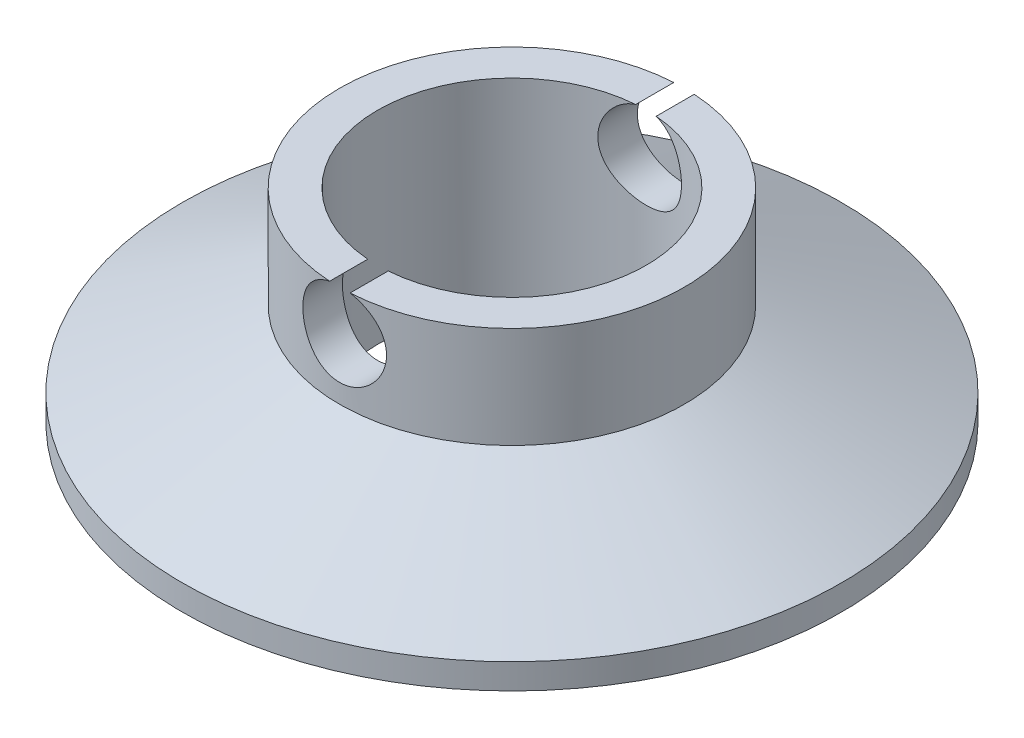
ISO-10303-21;
HEADER;
FILE_DESCRIPTION(('STEP AP214'),'2;1');
FILE_NAME('part.step','',(''),(''),'','','');
FILE_SCHEMA(('AUTOMOTIVE_DESIGN { 1 0 10303 214 1 1 1 1 }'));
ENDSEC;
DATA;
#1=APPLICATION_CONTEXT('core data for automotive mechanical design processes');
#2=APPLICATION_PROTOCOL_DEFINITION('international standard','automotive_design',2000,#1);
#3=PRODUCT_CONTEXT('',#1,'mechanical');
#4=PRODUCT('Part','Part','',(#3));
#5=PRODUCT_RELATED_PRODUCT_CATEGORY('part','',(#4));
#6=PRODUCT_DEFINITION_FORMATION('','',#4);
#7=PRODUCT_DEFINITION_CONTEXT('part definition',#1,'design');
#8=PRODUCT_DEFINITION('design','',#6,#7);
#9=PRODUCT_DEFINITION_SHAPE('','',#8);
#10=(LENGTH_UNIT() NAMED_UNIT(*) SI_UNIT(.MILLI.,.METRE.));
#11=(NAMED_UNIT(*) PLANE_ANGLE_UNIT() SI_UNIT($,.RADIAN.));
#12=(NAMED_UNIT(*) SI_UNIT($,.STERADIAN.) SOLID_ANGLE_UNIT());
#13=UNCERTAINTY_MEASURE_WITH_UNIT(LENGTH_MEASURE(1.E-05),#10,'distance_accuracy_value','');
#14=(GEOMETRIC_REPRESENTATION_CONTEXT(3) GLOBAL_UNCERTAINTY_ASSIGNED_CONTEXT((#13)) GLOBAL_UNIT_ASSIGNED_CONTEXT((#10,
#11,#12)) REPRESENTATION_CONTEXT('',''));
#15=CARTESIAN_POINT('',(0.,0.,0.));
#16=DIRECTION('',(0.,0.,1.));
#17=DIRECTION('',(1.,0.,0.));
#18=AXIS2_PLACEMENT_3D('',#15,#16,#17);
#19=CARTESIAN_POINT('',(5.3,12.9891874831611,0.));
#20=DIRECTION('',(0.,1.,0.));
#21=DIRECTION('',(-1.,0.,0.));
#22=AXIS2_PLACEMENT_3D('',#19,#20,#21);
#23=CYLINDRICAL_SURFACE('',#22,5.3);
#24=CARTESIAN_POINT('',(5.3,0.,0.));
#25=DIRECTION('',(0.,1.,0.));
#26=DIRECTION('',(-1.,0.,0.));
#27=AXIS2_PLACEMENT_3D('',#24,#25,#26);
#28=CIRCLE('',#27,5.3);
#29=CARTESIAN_POINT('',(0.,0.,0.));
#30=VERTEX_POINT('',#29);
#31=EDGE_CURVE('E82',#30,#30,#28,.T.);
#32=ORIENTED_EDGE('',*,*,#31,.F.);
#33=EDGE_LOOP('',(#32));
#34=FACE_BOUND('',#33,.T.);
#35=CARTESIAN_POINT('',(5.3,8.,0.));
#36=DIRECTION('',(0.,1.,0.));
#37=DIRECTION('',(-1.,0.,0.));
#38=AXIS2_PLACEMENT_3D('',#35,#36,#37);
#39=CIRCLE('',#38,5.3);
#40=CARTESIAN_POINT('',(4.89688711258507,8.,-5.28464757576132));
#41=VERTEX_POINT('',#40);
#42=CARTESIAN_POINT('',(4.89688711258507,8.,5.28464757576132));
#43=VERTEX_POINT('',#42);
#44=EDGE_CURVE('E86',#41,#43,#39,.T.);
#45=ORIENTED_EDGE('',*,*,#44,.T.);
#46=CARTESIAN_POINT('',(4.89688711258507,8.,5.28464757576132));
#47=CARTESIAN_POINT('',(4.85187303527529,7.9886592219359,5.28121678496733));
#48=CARTESIAN_POINT('',(4.80740221455885,7.97543341836276,5.27724266006828));
#49=CARTESIAN_POINT('',(4.71982730364138,7.94532986851614,5.26833288120692));
#50=CARTESIAN_POINT('',(4.67672282394611,7.92845317391061,5.26339750418158));
#51=CARTESIAN_POINT('',(4.55007062963855,7.87261381706816,5.24736274941369));
#52=CARTESIAN_POINT('',(4.46893641309748,7.82837889607839,5.23501472471735));
#53=CARTESIAN_POINT('',(4.31547814325736,7.72727882623887,5.20833959619137));
#54=CARTESIAN_POINT('',(4.24314896190254,7.67042108394121,5.19401365477805));
#55=CARTESIAN_POINT('',(4.10892819205841,7.54553480908309,5.1648879715981));
#56=CARTESIAN_POINT('',(4.04704069327803,7.47750192003121,5.15008804687359));
#57=CARTESIAN_POINT('',(3.93404414278354,7.33030476070273,5.12129382260728));
#58=CARTESIAN_POINT('',(3.88321070604488,7.25092342504644,5.10732533420736));
#59=CARTESIAN_POINT('',(3.7956493339156,7.08430989131347,5.08222526094042));
#60=CARTESIAN_POINT('',(3.75891910012355,6.99707897534691,5.0710932139176));
#61=CARTESIAN_POINT('',(3.70138315790502,6.81894340174766,5.05324864696181));
#62=CARTESIAN_POINT('',(3.68028432191817,6.72814188087293,5.04645512363811));
#63=CARTESIAN_POINT('',(3.6536750532422,6.54406426195088,5.03783853688604));
#64=CARTESIAN_POINT('',(3.64815914809733,6.45078904424163,5.03601372853907));
#65=CARTESIAN_POINT('',(3.65281810406351,6.26880385777008,5.03753825011536));
#66=CARTESIAN_POINT('',(3.66231294415675,6.18007367224953,5.04066334985724));
#67=CARTESIAN_POINT('',(3.69538135454225,6.00555368879652,5.05128659885817));
#68=CARTESIAN_POINT('',(3.71895572260249,5.91976405777173,5.05878499591447));
#69=CARTESIAN_POINT('',(3.77944412939173,5.75325920661999,5.07729296816383));
#70=CARTESIAN_POINT('',(3.81638382569129,5.67255409958975,5.08830929195217));
#71=CARTESIAN_POINT('',(3.90250744585655,5.51834289039149,5.11263245350094));
#72=CARTESIAN_POINT('',(3.95169429089997,5.44483851157081,5.12593983748879));
#73=CARTESIAN_POINT('',(4.06349981517368,5.30362698966794,5.15407884525732));
#74=CARTESIAN_POINT('',(4.12661957722763,5.23632442888689,5.16895197452567));
#75=CARTESIAN_POINT('',(4.26326278714012,5.11308787891517,5.19808135400771));
#76=CARTESIAN_POINT('',(4.33678783939681,5.05715564616894,5.21233750864623));
#77=CARTESIAN_POINT('',(4.49393444819785,4.95722783094336,5.23896185160454));
#78=CARTESIAN_POINT('',(4.57772371399344,4.91348391476483,5.25128821323165));
#79=CARTESIAN_POINT('',(4.75192749988562,4.84082831978703,5.27231449547139));
#80=CARTESIAN_POINT('',(4.84234029961863,4.81191280503304,5.28101535385506));
#81=CARTESIAN_POINT('',(5.02408815323665,4.77065307898283,5.29357125518137));
#82=CARTESIAN_POINT('',(5.11529722576052,4.75779974246569,5.29757491727544));
#83=CARTESIAN_POINT('',(5.29865814224583,4.74744876515884,5.30079228704776));
#84=CARTESIAN_POINT('',(5.3908097858883,4.74994792661386,5.30000699221294));
#85=CARTESIAN_POINT('',(5.57026458077088,4.76986397262478,5.29384186206912));
#86=CARTESIAN_POINT('',(5.65762787183264,4.78679206626689,5.28861258702528));
#87=CARTESIAN_POINT('',(5.82821235908027,4.83432651322694,5.27430779925766));
#88=CARTESIAN_POINT('',(5.9114332359064,4.86493391934285,5.26523199049672));
#89=CARTESIAN_POINT('',(6.07278930633923,4.93941428031546,5.24399869337172));
#90=CARTESIAN_POINT('',(6.15083103481063,4.98347680918113,5.23179759591944));
#91=CARTESIAN_POINT('',(6.29858484778823,5.08345515371452,5.20561879408853));
#92=CARTESIAN_POINT('',(6.3682947794401,5.13937402263457,5.19164063245117));
#93=CARTESIAN_POINT('',(6.50044075500216,5.26420103900265,5.16272303705398));
#94=CARTESIAN_POINT('',(6.56245710784924,5.33355050479678,5.14776775075411));
#95=CARTESIAN_POINT('',(6.67408485931754,5.48184715331635,5.11910355736498));
#96=CARTESIAN_POINT('',(6.72369514286205,5.56079519782978,5.10539476238272));
#97=CARTESIAN_POINT('',(6.80940900212662,5.72695463122123,5.08071835084615));
#98=CARTESIAN_POINT('',(6.84540052582057,5.81422747685071,5.06977371153625));
#99=CARTESIAN_POINT('',(6.90204698254477,5.9940194351966,5.05216158816919));
#100=CARTESIAN_POINT('',(6.92270748354682,6.08653663009974,5.0454925514043));
#101=CARTESIAN_POINT('',(6.94737371695941,6.27008532254777,5.03749158974102));
#102=CARTESIAN_POINT('',(6.95203283557149,6.36102005030556,5.03595036618992));
#103=CARTESIAN_POINT('',(6.94634747224587,6.54235956859327,5.03781195703903));
#104=CARTESIAN_POINT('',(6.93600494740275,6.63276442670449,5.04121412653082));
#105=CARTESIAN_POINT('',(6.90117864983947,6.80805351686942,5.05238003248266));
#106=CARTESIAN_POINT('',(6.87706894972793,6.89302013835026,5.06002825117876));
#107=CARTESIAN_POINT('',(6.81579920314906,7.05770423774253,5.07871755890766));
#108=CARTESIAN_POINT('',(6.77863741931131,7.13742101516582,5.08975909960305));
#109=CARTESIAN_POINT('',(6.69100116901033,7.29205182495548,5.11441533380466));
#110=CARTESIAN_POINT('',(6.64015160337423,7.36674202668842,5.12809886121012));
#111=CARTESIAN_POINT('',(6.52704368738695,7.50678355597121,5.15633152330512));
#112=CARTESIAN_POINT('',(6.46477926177511,7.5721298773628,5.17088111613735));
#113=CARTESIAN_POINT('',(6.32765395995585,7.69429465247567,5.1999068963558));
#114=CARTESIAN_POINT('',(6.25238680716932,7.75066373671444,5.21435653465924));
#115=CARTESIAN_POINT('',(6.09313471611612,7.8498995436729,5.24093661022201));
#116=CARTESIAN_POINT('',(6.00916351908536,7.89278713085066,5.25307061968227));
#117=CARTESIAN_POINT('',(5.88649349198317,7.94272727196584,5.26757249362312));
#118=CARTESIAN_POINT('',(5.85039832009739,7.9559702248156,5.27147141897365));
#119=CARTESIAN_POINT('',(5.77736365300905,7.97990371044114,5.27858570574482));
#120=CARTESIAN_POINT('',(5.74042544050956,7.99059787010314,5.2818020377602));
#121=CARTESIAN_POINT('',(5.703112887415,8.00000000000013,5.2846475757614));
#122=B_SPLINE_CURVE_WITH_KNOTS('',3,(#46,#47,#48,#49,#50,#51,#52,#53,#54,#55,#56,#57,#58,#59,
#60,#61,#62,#63,#64,#65,#66,#67,#68,#69,#70,#71,#72,#73,#74,#75,#76,#77,#78,#79,#80,#81,#82,#83,
#84,#85,#86,#87,#88,#89,#90,#91,#92,#93,#94,#95,#96,#97,#98,#99,#100,#101,#102,#103,#104,#105,
#106,#107,#108,#109,#110,#111,#112,#113,#114,#115,#116,#117,#118,#119,#120,#121),.UNSPECIFIED.,
.F.,.F.,(4,2,2,2,2,2,2,2,2,2,2,2,2,2,2,2,2,2,2,2,2,2,2,2,2,2,2,2,2,2,2,2,2,2,2,2,2,4),(0.,
0.139548039012117,0.279055933511436,0.557312624680936,0.835406475775953,1.11360899670435,
1.39810734484341,1.68255930853856,1.96153182180678,2.2404063525684,2.50700478999187,
2.77361833473128,3.04074643995643,3.30793832144888,3.58704292935301,3.8661906195532,
4.15073486488324,4.43520546436894,4.71040946992628,4.98555615548139,5.25173639552169,
5.51793712506326,5.78807650831907,6.05828554271953,6.33966200446363,6.62106374767678,
6.90473290243425,7.18829898279371,7.46013889786769,7.73194335225514,7.99669184146855,
8.26147558487077,8.53442239559427,8.807514899089,9.0916044791327,9.37525220208325,
9.49110618358262,9.6067943093154),.UNSPECIFIED.);
#123=CARTESIAN_POINT('',(5.70311288741494,8.,5.28464757576132));
#124=VERTEX_POINT('',#123);
#125=EDGE_CURVE('E50',#43,#124,#122,.T.);
#126=ORIENTED_EDGE('',*,*,#125,.T.);
#127=CARTESIAN_POINT('',(5.70311288741494,8.,-5.28464757576132));
#128=VERTEX_POINT('',#127);
#129=EDGE_CURVE('E88',#124,#128,#39,.T.);
#130=ORIENTED_EDGE('',*,*,#129,.T.);
#131=CARTESIAN_POINT('',(5.70311288741494,8.,-5.28464757576132));
#132=CARTESIAN_POINT('',(5.74812696472472,7.9886592219359,-5.28121678496733));
#133=CARTESIAN_POINT('',(5.79259778544115,7.97543341836276,-5.27724266006828));
#134=CARTESIAN_POINT('',(5.88017269635863,7.94532986851614,-5.26833288120692));
#135=CARTESIAN_POINT('',(5.92327717605389,7.92845317391061,-5.26339750418158));
#136=CARTESIAN_POINT('',(6.04992937036145,7.87261381706816,-5.24736274941369));
#137=CARTESIAN_POINT('',(6.13106358690252,7.82837889607839,-5.23501472471735));
#138=CARTESIAN_POINT('',(6.28452185674264,7.72727882623887,-5.20833959619137));
#139=CARTESIAN_POINT('',(6.35685103809746,7.67042108394121,-5.19401365477805));
#140=CARTESIAN_POINT('',(6.49107180794159,7.5455348090831,-5.1648879715981));
#141=CARTESIAN_POINT('',(6.55295930672198,7.47750192003122,-5.15008804687359));
#142=CARTESIAN_POINT('',(6.66595585721647,7.33030476070274,-5.12129382260728));
#143=CARTESIAN_POINT('',(6.71678929395512,7.25092342504644,-5.10732533420736));
#144=CARTESIAN_POINT('',(6.8043506660844,7.08430989131347,-5.08222526094042));
#145=CARTESIAN_POINT('',(6.84108089987645,6.99707897534692,-5.07109321391761));
#146=CARTESIAN_POINT('',(6.89861684209498,6.81894340174767,-5.05324864696181));
#147=CARTESIAN_POINT('',(6.91971567808183,6.72814188087294,-5.04645512363811));
#148=CARTESIAN_POINT('',(6.9463249467578,6.54406426195089,-5.03783853688604));
#149=CARTESIAN_POINT('',(6.95184085190267,6.45078904424164,-5.03601372853907));
#150=CARTESIAN_POINT('',(6.9471818959365,6.26880385777009,-5.03753825011536));
#151=CARTESIAN_POINT('',(6.93768705584326,6.18007367224953,-5.04066334985724));
#152=CARTESIAN_POINT('',(6.90461864545776,6.00555368879652,-5.05128659885817));
#153=CARTESIAN_POINT('',(6.88104427739751,5.91976405777173,-5.05878499591447));
#154=CARTESIAN_POINT('',(6.82055587060828,5.75325920661999,-5.07729296816383));
#155=CARTESIAN_POINT('',(6.78361617430871,5.67255409958975,-5.08830929195216));
#156=CARTESIAN_POINT('',(6.69749255414345,5.5183428903915,-5.11263245350094));
#157=CARTESIAN_POINT('',(6.64830570910004,5.44483851157081,-5.12593983748879));
#158=CARTESIAN_POINT('',(6.53650018482633,5.30362698966794,-5.15407884525732));
#159=CARTESIAN_POINT('',(6.47338042277237,5.23632442888689,-5.16895197452567));
#160=CARTESIAN_POINT('',(6.33673721285989,5.11308787891517,-5.19808135400771));
#161=CARTESIAN_POINT('',(6.2632121606032,5.05715564616894,-5.21233750864623));
#162=CARTESIAN_POINT('',(6.10606555180215,4.95722783094336,-5.23896185160454));
#163=CARTESIAN_POINT('',(6.02227628600657,4.91348391476483,-5.25128821323165));
#164=CARTESIAN_POINT('',(5.84807250011439,4.84082831978703,-5.27231449547138));
#165=CARTESIAN_POINT('',(5.75765970038138,4.81191280503304,-5.28101535385506));
#166=CARTESIAN_POINT('',(5.57591184676336,4.77065307898283,-5.29357125518136));
#167=CARTESIAN_POINT('',(5.48470277423949,4.75779974246569,-5.29757491727544));
#168=CARTESIAN_POINT('',(5.30134185775418,4.74744876515884,-5.30079228704776));
#169=CARTESIAN_POINT('',(5.20919021411171,4.74994792661386,-5.30000699221294));
#170=CARTESIAN_POINT('',(5.02973541922913,4.76986397262478,-5.29384186206912));
#171=CARTESIAN_POINT('',(4.94237212816736,4.78679206626689,-5.28861258702528));
#172=CARTESIAN_POINT('',(4.77178764091974,4.83432651322693,-5.27430779925767));
#173=CARTESIAN_POINT('',(4.68856676409361,4.86493391934285,-5.26523199049673));
#174=CARTESIAN_POINT('',(4.52721069366078,4.93941428031546,-5.24399869337172));
#175=CARTESIAN_POINT('',(4.44916896518938,4.98347680918113,-5.23179759591944));
#176=CARTESIAN_POINT('',(4.30141515221177,5.08345515371452,-5.20561879408853));
#177=CARTESIAN_POINT('',(4.2317052205599,5.13937402263457,-5.19164063245117));
#178=CARTESIAN_POINT('',(4.09955924499785,5.26420103900265,-5.16272303705398));
#179=CARTESIAN_POINT('',(4.03754289215077,5.33355050479678,-5.14776775075411));
#180=CARTESIAN_POINT('',(3.92591514068247,5.48184715331635,-5.11910355736498));
#181=CARTESIAN_POINT('',(3.87630485713795,5.56079519782978,-5.10539476238272));
#182=CARTESIAN_POINT('',(3.79059099787338,5.72695463122123,-5.08071835084615));
#183=CARTESIAN_POINT('',(3.75459947417944,5.8142274768507,-5.06977371153625));
#184=CARTESIAN_POINT('',(3.69795301745523,5.9940194351966,-5.05216158816919));
#185=CARTESIAN_POINT('',(3.67729251645319,6.08653663009974,-5.0454925514043));
#186=CARTESIAN_POINT('',(3.6526262830406,6.27008532254776,-5.03749158974102));
#187=CARTESIAN_POINT('',(3.64796716442852,6.36102005030556,-5.03595036618992));
#188=CARTESIAN_POINT('',(3.65365252775414,6.54235956859327,-5.03781195703903));
#189=CARTESIAN_POINT('',(3.66399505259726,6.63276442670449,-5.04121412653082));
#190=CARTESIAN_POINT('',(3.69882135016053,6.80805351686941,-5.05238003248266));
#191=CARTESIAN_POINT('',(3.72293105027207,6.89302013835026,-5.06002825117876));
#192=CARTESIAN_POINT('',(3.78420079685094,7.05770423774252,-5.07871755890766));
#193=CARTESIAN_POINT('',(3.82136258068869,7.13742101516582,-5.08975909960305));
#194=CARTESIAN_POINT('',(3.90899883098967,7.29205182495547,-5.11441533380466));
#195=CARTESIAN_POINT('',(3.95984839662577,7.36674202668842,-5.12809886121012));
#196=CARTESIAN_POINT('',(4.07295631261306,7.5067835559712,-5.15633152330512));
#197=CARTESIAN_POINT('',(4.13522073822489,7.5721298773628,-5.17088111613735));
#198=CARTESIAN_POINT('',(4.27234604004416,7.69429465247567,-5.1999068963558));
#199=CARTESIAN_POINT('',(4.34761319283068,7.75066373671444,-5.21435653465924));
#200=CARTESIAN_POINT('',(4.50686528388388,7.8498995436729,-5.24093661022201));
#201=CARTESIAN_POINT('',(4.59083648091465,7.89278713085066,-5.25307061968227));
#202=CARTESIAN_POINT('',(4.71350650801683,7.94272727196584,-5.26757249362312));
#203=CARTESIAN_POINT('',(4.74960167990262,7.9559702248156,-5.27147141897365));
#204=CARTESIAN_POINT('',(4.82263634699095,7.97990371044114,-5.27858570574482));
#205=CARTESIAN_POINT('',(4.85957455949045,7.99059787010314,-5.2818020377602));
#206=CARTESIAN_POINT('',(4.896887112585,8.00000000000013,-5.2846475757614));
#207=B_SPLINE_CURVE_WITH_KNOTS('',3,(#131,#132,#133,#134,#135,#136,#137,#138,#139,#140,#141,
#142,#143,#144,#145,#146,#147,#148,#149,#150,#151,#152,#153,#154,#155,#156,#157,#158,#159,#160,
#161,#162,#163,#164,#165,#166,#167,#168,#169,#170,#171,#172,#173,#174,#175,#176,#177,#178,#179,
#180,#181,#182,#183,#184,#185,#186,#187,#188,#189,#190,#191,#192,#193,#194,#195,#196,#197,#198,
#199,#200,#201,#202,#203,#204,#205,#206),.UNSPECIFIED.,.F.,.F.,(4,2,2,2,2,2,2,2,2,2,2,2,2,2,2,2,
2,2,2,2,2,2,2,2,2,2,2,2,2,2,2,2,2,2,2,2,2,4),(0.,0.139548039012116,0.279055933511435,
0.557312624680934,0.83540647577595,1.11360899670434,1.3981073448434,1.68255930853856,
1.96153182180677,2.2404063525684,2.50700478999186,2.77361833473128,3.04074643995643,
3.30793832144888,3.58704292935301,3.8661906195532,4.15073486488324,4.43520546436894,
4.71040946992628,4.98555615548139,5.25173639552169,5.51793712506326,5.78807650831907,
6.05828554271953,6.33966200446363,6.62106374767678,6.90473290243425,7.18829898279371,
7.46013889786769,7.73194335225514,7.99669184146854,8.26147558487077,8.53442239559427,
8.807514899089,9.0916044791327,9.37525220208325,9.49110618358262,9.6067943093154),.UNSPECIFIED.);
#208=EDGE_CURVE('E76',#128,#41,#207,.T.);
#209=ORIENTED_EDGE('',*,*,#208,.T.);
#210=EDGE_LOOP('',(#45,#126,#130,#209));
#211=FACE_BOUND('',#210,.T.);
#212=ADVANCED_FACE('F35',(#34,#211),#23,.F.);
#213=CARTESIAN_POINT('',(5.3,12.9891874831611,0.));
#214=DIRECTION('',(0.,1.,0.));
#215=DIRECTION('',(-1.,0.,0.));
#216=AXIS2_PLACEMENT_3D('',#213,#214,#215);
#217=CYLINDRICAL_SURFACE('',#216,6.8);
#218=CARTESIAN_POINT('',(5.3,4.,0.));
#219=DIRECTION('',(0.,1.,0.));
#220=DIRECTION('',(-1.,0.,0.));
#221=AXIS2_PLACEMENT_3D('',#218,#219,#220);
#222=CIRCLE('',#221,6.8);
#223=CARTESIAN_POINT('',(-1.5,4.,0.));
#224=VERTEX_POINT('',#223);
#225=EDGE_CURVE('E104',#224,#224,#222,.T.);
#226=ORIENTED_EDGE('',*,*,#225,.T.);
#227=EDGE_LOOP('',(#226));
#228=FACE_BOUND('',#227,.T.);
#229=CARTESIAN_POINT('',(5.3,8.,0.));
#230=DIRECTION('',(0.,1.,0.));
#231=DIRECTION('',(-1.,0.,0.));
#232=AXIS2_PLACEMENT_3D('',#229,#230,#231);
#233=CIRCLE('',#232,6.8);
#234=CARTESIAN_POINT('',(4.89688711258507,8.,-6.78804095450226));
#235=VERTEX_POINT('',#234);
#236=CARTESIAN_POINT('',(4.89688711258507,8.,6.78804095450226));
#237=VERTEX_POINT('',#236);
#238=EDGE_CURVE('E93',#235,#237,#233,.T.);
#239=ORIENTED_EDGE('',*,*,#238,.F.);
#240=CARTESIAN_POINT('',(4.89688711258507,8.,-6.78804095450226));
#241=CARTESIAN_POINT('',(4.85186765629045,7.9886576185512,-6.78536972057657));
#242=CARTESIAN_POINT('',(4.80737467815087,7.97542591281356,-6.7822753190049));
#243=CARTESIAN_POINT('',(4.71971947793974,7.94529083971291,-6.77533778406438));
#244=CARTESIAN_POINT('',(4.67655699872139,7.92838818698289,-6.77149479643975));
#245=CARTESIAN_POINT('',(4.54964718537712,7.87241088776101,-6.75900630131355));
#246=CARTESIAN_POINT('',(4.46827174676536,7.82801469708224,-6.74938831531304));
#247=CARTESIAN_POINT('',(4.31427107863073,7.72640891120724,-6.72862524048811));
#248=CARTESIAN_POINT('',(4.24164429641899,7.66920159486436,-6.71748042339434));
#249=CARTESIAN_POINT('',(4.10694321283138,7.54350265463932,-6.6948699239947));
#250=CARTESIAN_POINT('',(4.04487049615954,7.47500933918745,-6.68340419380385));
#251=CARTESIAN_POINT('',(3.93219671878838,7.32754531778894,-6.66126607127537));
#252=CARTESIAN_POINT('',(3.88176120362481,7.2484460666675,-6.65060642541037));
#253=CARTESIAN_POINT('',(3.7949192283315,7.08263286773788,-6.63149441382741));
#254=CARTESIAN_POINT('',(3.75851226066987,6.99591919554746,-6.62304196825981));
#255=CARTESIAN_POINT('',(3.70124382842021,6.81841284603828,-6.60945092353416));
#256=CARTESIAN_POINT('',(3.68019950883711,6.72768225613595,-6.60427344638721));
#257=CARTESIAN_POINT('',(3.65366245222502,6.54384962218276,-6.59770906964501));
#258=CARTESIAN_POINT('',(3.64816622377022,6.45074811527566,-6.59632131904424));
#259=CARTESIAN_POINT('',(3.65284786427697,6.26741227296866,-6.59749132761039));
#260=CARTESIAN_POINT('',(3.66261980037946,6.17716660170667,-6.59994690757603));
#261=CARTESIAN_POINT('',(3.69675664347291,5.99964886108374,-6.60832167651104));
#262=CARTESIAN_POINT('',(3.7211220686018,5.91237689741978,-6.61424098845911));
#263=CARTESIAN_POINT('',(3.78371489313368,5.74308573515891,-6.62886913522215));
#264=CARTESIAN_POINT('',(3.82196044033264,5.66107357953798,-6.6375816202703));
#265=CARTESIAN_POINT('',(3.91119863267264,5.50453873689308,-6.65682408669997));
#266=CARTESIAN_POINT('',(3.96219325322651,5.43001721302073,-6.66735434965985));
#267=CARTESIAN_POINT('',(4.07708643776995,5.28846478757087,-6.68939351046275));
#268=CARTESIAN_POINT('',(4.14129235677471,5.22168608071689,-6.70092099707578));
#269=CARTESIAN_POINT('',(4.28001498705404,5.09974612515368,-6.72343367307983));
#270=CARTESIAN_POINT('',(4.35453255974565,5.04458584799919,-6.73441881706039));
#271=CARTESIAN_POINT('',(4.51279487143721,4.94688308533494,-6.75475633621964));
#272=CARTESIAN_POINT('',(4.59663206827345,4.90448602551198,-6.76408942775822));
#273=CARTESIAN_POINT('',(4.77051244082677,4.83445740205931,-6.77991542102957));
#274=CARTESIAN_POINT('',(4.86055465462378,4.80682355558006,-6.78640876184747));
#275=CARTESIAN_POINT('',(5.04232402432299,4.76764926862019,-6.79571277710236));
#276=CARTESIAN_POINT('',(5.13397884504901,4.75579065550468,-6.79859618789992));
#277=CARTESIAN_POINT('',(5.31801765688059,4.747529959853,-6.80059845610896));
#278=CARTESIAN_POINT('',(5.41040155383781,4.75112591318539,-6.7997177918994));
#279=CARTESIAN_POINT('',(5.59136377890117,4.7734217839597,-6.79434663243856));
#280=CARTESIAN_POINT('',(5.6799812129318,4.79182369352552,-6.7899273689364));
#281=CARTESIAN_POINT('',(5.8528369143618,4.84276158773716,-6.77804412068094));
#282=CARTESIAN_POINT('',(5.9370749136136,4.87529843670991,-6.77057994973854));
#283=CARTESIAN_POINT('',(6.099795202073,4.95394321061299,-6.75330281926451));
#284=CARTESIAN_POINT('',(6.17820747927737,5.000190540755,-6.74346593600018));
#285=CARTESIAN_POINT('',(6.32627822466876,5.10482630448859,-6.72252582873378));
#286=CARTESIAN_POINT('',(6.39593522825981,5.16321676507694,-6.71142239345189));
#287=CARTESIAN_POINT('',(6.52636673699261,5.29223236836837,-6.68883568937065));
#288=CARTESIAN_POINT('',(6.58687186739946,5.3631297188323,-6.67734991887291));
#289=CARTESIAN_POINT('',(6.69517731452615,5.5142126970605,-6.65556469831852));
#290=CARTESIAN_POINT('',(6.74297734460136,5.5943985343273,-6.64526527503048));
#291=CARTESIAN_POINT('',(6.8245594339976,5.76208994886851,-6.62702637017086));
#292=CARTESIAN_POINT('',(6.85831090226109,5.8496110064034,-6.61909204920862));
#293=CARTESIAN_POINT('',(6.91054322269371,6.02932247243534,-6.60657857875695));
#294=CARTESIAN_POINT('',(6.92902716293963,6.12151193267535,-6.60199875079436));
#295=CARTESIAN_POINT('',(6.94981566158683,6.30539895072751,-6.59683414356368));
#296=CARTESIAN_POINT('',(6.9525242946236,6.3970481282329,-6.59614959971061));
#297=CARTESIAN_POINT('',(6.94275099444529,6.57947600441476,-6.59859029167977));
#298=CARTESIAN_POINT('',(6.93027009656898,6.67025476199515,-6.60171526784002));
#299=CARTESIAN_POINT('',(6.89080866916461,6.84713841366838,-6.61133327693581));
#300=CARTESIAN_POINT('',(6.86402208678746,6.93328924335672,-6.61778121922321));
#301=CARTESIAN_POINT('',(6.79690614821728,7.09988484833932,-6.63328358157589));
#302=CARTESIAN_POINT('',(6.7565758883013,7.1803292424288,-6.64233817556833));
#303=CARTESIAN_POINT('',(6.66258068934475,7.33500146956386,-6.66226090918825));
#304=CARTESIAN_POINT('',(6.60866486871264,7.40907253589521,-6.67316173752447));
#305=CARTESIAN_POINT('',(6.48935788691006,7.54728604131402,-6.6954538341833));
#306=CARTESIAN_POINT('',(6.42396111609676,7.61142359787762,-6.7068453401904));
#307=CARTESIAN_POINT('',(6.28179408231884,7.72940296834503,-6.72914355488842));
#308=CARTESIAN_POINT('',(6.20479761873392,7.78297530843883,-6.74003318281045));
#309=CARTESIAN_POINT('',(6.0427193984459,7.87634065282302,-6.75980710620821));
#310=CARTESIAN_POINT('',(5.95765199610673,7.91615755693847,-6.76869487043704));
#311=CARTESIAN_POINT('',(5.84252209220702,7.9585320032819,-6.77837962819747));
#312=CARTESIAN_POINT('',(5.81494185926505,7.96786007159614,-6.78053213058349));
#313=CARTESIAN_POINT('',(5.75934784785053,7.98503694168862,-6.78452443320888));
#314=CARTESIAN_POINT('',(5.73133478208771,7.99288794232268,-6.78636469785758));
#315=CARTESIAN_POINT('',(5.70311288741494,8.,-6.78804095450227));
#316=B_SPLINE_CURVE_WITH_KNOTS('',3,(#240,#241,#242,#243,#244,#245,#246,#247,#248,#249,#250,
#251,#252,#253,#254,#255,#256,#257,#258,#259,#260,#261,#262,#263,#264,#265,#266,#267,#268,#269,
#270,#271,#272,#273,#274,#275,#276,#277,#278,#279,#280,#281,#282,#283,#284,#285,#286,#287,#288,
#289,#290,#291,#292,#293,#294,#295,#296,#297,#298,#299,#300,#301,#302,#303,#304,#305,#306,#307,
#308,#309,#310,#311,#312,#313,#314,#315),.UNSPECIFIED.,.F.,.F.,(4,2,2,2,2,2,2,2,2,2,2,2,2,2,2,2,
2,2,2,2,2,2,2,2,2,2,2,2,2,2,2,2,2,2,2,2,2,4),(0.,0.139418637680734,0.278810158654562,
0.556963564781801,0.835067532002982,1.11321322002097,1.395100447009,1.67697747478059,
1.95544216140764,2.23384431199804,2.5049696179928,2.7761045507896,3.04759526816941,
3.31912807794124,3.59788877326942,3.87667276983984,4.15852249513597,4.44032862512082,
4.71636016055428,4.9923566159884,5.26293288202654,5.53352569566171,5.80697015102461,
6.08046028790008,6.3608710648116,6.64128816764122,6.92231273032989,7.20328043783639,
7.47701854885839,7.75073800256895,8.02083739458387,8.29095481298314,8.56648195734328,
8.84214410207152,9.12412030403992,9.40560408384684,9.49315747048468,9.58057947008275),.UNSPECIFIED.);
#317=CARTESIAN_POINT('',(5.70311288741494,8.,-6.78804095450226));
#318=VERTEX_POINT('',#317);
#319=EDGE_CURVE('E58',#235,#318,#316,.T.);
#320=ORIENTED_EDGE('',*,*,#319,.T.);
#321=CARTESIAN_POINT('',(5.70311288741494,8.,6.78804095450226));
#322=VERTEX_POINT('',#321);
#323=EDGE_CURVE('E103',#322,#318,#233,.T.);
#324=ORIENTED_EDGE('',*,*,#323,.F.);
#325=CARTESIAN_POINT('',(5.70311288741494,8.,6.78804095450226));
#326=CARTESIAN_POINT('',(5.74813234370955,7.9886576185512,6.78536972057657));
#327=CARTESIAN_POINT('',(5.79262532184914,7.97542591281356,6.7822753190049));
#328=CARTESIAN_POINT('',(5.88028052206026,7.94529083971291,6.77533778406438));
#329=CARTESIAN_POINT('',(5.92344300127862,7.92838818698289,6.77149479643975));
#330=CARTESIAN_POINT('',(6.05035281462289,7.87241088776101,6.75900630131355));
#331=CARTESIAN_POINT('',(6.13172825323464,7.82801469708224,6.74938831531304));
#332=CARTESIAN_POINT('',(6.28572892136927,7.72640891120724,6.72862524048811));
#333=CARTESIAN_POINT('',(6.35835570358102,7.66920159486436,6.71748042339434));
#334=CARTESIAN_POINT('',(6.49305678716862,7.54350265463932,6.6948699239947));
#335=CARTESIAN_POINT('',(6.55512950384047,7.47500933918745,6.68340419380385));
#336=CARTESIAN_POINT('',(6.66780328121162,7.32754531778894,6.66126607127537));
#337=CARTESIAN_POINT('',(6.71823879637519,7.2484460666675,6.65060642541037));
#338=CARTESIAN_POINT('',(6.8050807716685,7.08263286773788,6.63149441382741));
#339=CARTESIAN_POINT('',(6.84148773933013,6.99591919554746,6.62304196825981));
#340=CARTESIAN_POINT('',(6.8987561715798,6.81841284603828,6.60945092353416));
#341=CARTESIAN_POINT('',(6.91980049116289,6.72768225613595,6.60427344638721));
#342=CARTESIAN_POINT('',(6.94633754777499,6.54384962218276,6.59770906964501));
#343=CARTESIAN_POINT('',(6.95183377622979,6.45074811527565,6.59632131904424));
#344=CARTESIAN_POINT('',(6.94715213572304,6.26741227296866,6.59749132761039));
#345=CARTESIAN_POINT('',(6.93738019962055,6.17716660170667,6.59994690757603));
#346=CARTESIAN_POINT('',(6.90324335652709,5.99964886108374,6.60832167651104));
#347=CARTESIAN_POINT('',(6.87887793139821,5.91237689741978,6.61424098845911));
#348=CARTESIAN_POINT('',(6.81628510686633,5.74308573515891,6.62886913522215));
#349=CARTESIAN_POINT('',(6.77803955966736,5.66107357953798,6.6375816202703));
#350=CARTESIAN_POINT('',(6.68880136732737,5.50453873689308,6.65682408669997));
#351=CARTESIAN_POINT('',(6.6378067467735,5.43001721302073,6.66735434965985));
#352=CARTESIAN_POINT('',(6.52291356223005,5.28846478757087,6.68939351046275));
#353=CARTESIAN_POINT('',(6.45870764322529,5.22168608071689,6.70092099707578));
#354=CARTESIAN_POINT('',(6.31998501294596,5.09974612515368,6.72343367307983));
#355=CARTESIAN_POINT('',(6.24546744025435,5.04458584799919,6.73441881706039));
#356=CARTESIAN_POINT('',(6.0872051285628,4.94688308533494,6.75475633621964));
#357=CARTESIAN_POINT('',(6.00336793172655,4.90448602551198,6.76408942775822));
#358=CARTESIAN_POINT('',(5.82948755917323,4.83445740205931,6.77991542102957));
#359=CARTESIAN_POINT('',(5.73944534537623,4.80682355558005,6.78640876184747));
#360=CARTESIAN_POINT('',(5.55767597567702,4.76764926862019,6.79571277710236));
#361=CARTESIAN_POINT('',(5.466021154951,4.75579065550468,6.79859618789992));
#362=CARTESIAN_POINT('',(5.28198234311941,4.747529959853,6.80059845610896));
#363=CARTESIAN_POINT('',(5.1895984461622,4.75112591318539,6.7997177918994));
#364=CARTESIAN_POINT('',(5.00863622109883,4.7734217839597,6.79434663243856));
#365=CARTESIAN_POINT('',(4.9200187870682,4.79182369352552,6.7899273689364));
#366=CARTESIAN_POINT('',(4.74716308563821,4.84276158773716,6.77804412068094));
#367=CARTESIAN_POINT('',(4.66292508638641,4.87529843670991,6.77057994973854));
#368=CARTESIAN_POINT('',(4.500204797927,4.95394321061299,6.75330281926451));
#369=CARTESIAN_POINT('',(4.42179252072263,5.000190540755,6.74346593600018));
#370=CARTESIAN_POINT('',(4.27372177533125,5.10482630448859,6.72252582873378));
#371=CARTESIAN_POINT('',(4.20406477174019,5.16321676507694,6.71142239345189));
#372=CARTESIAN_POINT('',(4.0736332630074,5.29223236836837,6.68883568937065));
#373=CARTESIAN_POINT('',(4.01312813260055,5.3631297188323,6.67734991887291));
#374=CARTESIAN_POINT('',(3.90482268547385,5.51421269706051,6.65556469831852));
#375=CARTESIAN_POINT('',(3.85702265539864,5.59439853432731,6.64526527503048));
#376=CARTESIAN_POINT('',(3.77544056600241,5.76208994886851,6.62702637017086));
#377=CARTESIAN_POINT('',(3.74168909773891,5.8496110064034,6.61909204920862));
#378=CARTESIAN_POINT('',(3.68945677730629,6.02932247243534,6.60657857875695));
#379=CARTESIAN_POINT('',(3.67097283706038,6.12151193267535,6.60199875079436));
#380=CARTESIAN_POINT('',(3.65018433841317,6.30539895072751,6.59683414356368));
#381=CARTESIAN_POINT('',(3.6474757053764,6.39704812823291,6.59614959971061));
#382=CARTESIAN_POINT('',(3.65724900555472,6.57947600441476,6.59859029167977));
#383=CARTESIAN_POINT('',(3.66972990343103,6.67025476199515,6.60171526784002));
#384=CARTESIAN_POINT('',(3.7091913308354,6.84713841366838,6.61133327693581));
#385=CARTESIAN_POINT('',(3.73597791321255,6.93328924335672,6.6177812192232));
#386=CARTESIAN_POINT('',(3.80309385178272,7.09988484833932,6.63328358157589));
#387=CARTESIAN_POINT('',(3.8434241116987,7.1803292424288,6.64233817556833));
#388=CARTESIAN_POINT('',(3.93741931065526,7.33500146956387,6.66226090918825));
#389=CARTESIAN_POINT('',(3.99133513128736,7.40907253589521,6.67316173752447));
#390=CARTESIAN_POINT('',(4.11064211308995,7.54728604131403,6.6954538341833));
#391=CARTESIAN_POINT('',(4.17603888390324,7.61142359787763,6.7068453401904));
#392=CARTESIAN_POINT('',(4.31820591768117,7.72940296834503,6.72914355488842));
#393=CARTESIAN_POINT('',(4.39520238126608,7.78297530843883,6.74003318281045));
#394=CARTESIAN_POINT('',(4.55728060155411,7.87634065282302,6.75980710620821));
#395=CARTESIAN_POINT('',(4.64234800389327,7.91615755693847,6.76869487043704));
#396=CARTESIAN_POINT('',(4.75747790779299,7.9585320032819,6.77837962819747));
#397=CARTESIAN_POINT('',(4.78505814073496,7.96786007159614,6.78053213058349));
#398=CARTESIAN_POINT('',(4.84065215214947,7.98503694168862,6.78452443320888));
#399=CARTESIAN_POINT('',(4.8686652179123,7.99288794232268,6.78636469785758));
#400=CARTESIAN_POINT('',(4.89688711258506,8.,6.78804095450227));
#401=B_SPLINE_CURVE_WITH_KNOTS('',3,(#325,#326,#327,#328,#329,#330,#331,#332,#333,#334,#335,
#336,#337,#338,#339,#340,#341,#342,#343,#344,#345,#346,#347,#348,#349,#350,#351,#352,#353,#354,
#355,#356,#357,#358,#359,#360,#361,#362,#363,#364,#365,#366,#367,#368,#369,#370,#371,#372,#373,
#374,#375,#376,#377,#378,#379,#380,#381,#382,#383,#384,#385,#386,#387,#388,#389,#390,#391,#392,
#393,#394,#395,#396,#397,#398,#399,#400),.UNSPECIFIED.,.F.,.F.,(4,2,2,2,2,2,2,2,2,2,2,2,2,2,2,2,
2,2,2,2,2,2,2,2,2,2,2,2,2,2,2,2,2,2,2,2,2,4),(0.,0.139418637680735,0.278810158654562,
0.556963564781801,0.835067532002982,1.11321322002097,1.395100447009,1.6769774747806,
1.95544216140764,2.23384431199804,2.5049696179928,2.7761045507896,3.04759526816942,
3.31912807794124,3.59788877326942,3.87667276983984,4.15852249513597,4.44032862512082,
4.71636016055428,4.9923566159884,5.26293288202654,5.53352569566171,5.80697015102461,
6.08046028790008,6.3608710648116,6.64128816764122,6.92231273032989,7.20328043783639,
7.47701854885839,7.75073800256895,8.02083739458387,8.29095481298314,8.56648195734328,
8.84214410207152,9.12412030403992,9.40560408384684,9.49315747048467,9.58057947008275),.UNSPECIFIED.);
#402=EDGE_CURVE('E89',#322,#237,#401,.T.);
#403=ORIENTED_EDGE('',*,*,#402,.T.);
#404=EDGE_LOOP('',(#239,#320,#324,#403));
#405=FACE_BOUND('',#404,.T.);
#406=ADVANCED_FACE('F120',(#228,#405),#217,.T.);
#407=CARTESIAN_POINT('',(-1.5,8.,0.));
#408=DIRECTION('',(0.,1.,0.));
#409=DIRECTION('',(-1.,0.,0.));
#410=AXIS2_PLACEMENT_3D('',#407,#408,#409);
#411=PLANE('',#410);
#412=ORIENTED_EDGE('',*,*,#323,.T.);
#413=DIRECTION('',(0.,0.,-1.));
#414=VECTOR('',#413,1.);
#415=CARTESIAN_POINT('',(5.70311288741494,8.,10.));
#416=LINE('',#415,#414);
#417=EDGE_CURVE('E11',#318,#128,#416,.F.);
#418=ORIENTED_EDGE('',*,*,#417,.T.);
#419=ORIENTED_EDGE('',*,*,#129,.F.);
#420=EDGE_CURVE('E39',#124,#322,#416,.F.);
#421=ORIENTED_EDGE('',*,*,#420,.T.);
#422=EDGE_LOOP('',(#412,#418,#419,#421));
#423=FACE_BOUND('',#422,.T.);
#424=ADVANCED_FACE('F124',(#423),#411,.T.);
#425=ORIENTED_EDGE('',*,*,#238,.T.);
#426=DIRECTION('',(0.,0.,-1.));
#427=VECTOR('',#426,1.);
#428=CARTESIAN_POINT('',(4.89688711258507,8.,10.));
#429=LINE('',#428,#427);
#430=EDGE_CURVE('E81',#237,#43,#429,.T.);
#431=ORIENTED_EDGE('',*,*,#430,.T.);
#432=ORIENTED_EDGE('',*,*,#44,.F.);
#433=EDGE_CURVE('E73',#41,#235,#429,.T.);
#434=ORIENTED_EDGE('',*,*,#433,.T.);
#435=EDGE_LOOP('',(#425,#431,#432,#434));
#436=FACE_BOUND('',#435,.T.);
#437=ADVANCED_FACE('F91',(#436),#411,.T.);
#438=CARTESIAN_POINT('',(0.,0.,0.));
#439=DIRECTION('',(0.,-1.,0.));
#440=DIRECTION('',(1.,0.,0.));
#441=AXIS2_PLACEMENT_3D('',#438,#439,#440);
#442=PLANE('',#441);
#443=ORIENTED_EDGE('',*,*,#31,.T.);
#444=EDGE_LOOP('',(#443));
#445=FACE_BOUND('',#444,.T.);
#446=CARTESIAN_POINT('',(5.3,0.,0.));
#447=DIRECTION('',(0.,1.,0.));
#448=DIRECTION('',(-1.,0.,0.));
#449=AXIS2_PLACEMENT_3D('',#446,#447,#448);
#450=CIRCLE('',#449,13.);
#451=CARTESIAN_POINT('',(-7.7,0.,0.));
#452=VERTEX_POINT('',#451);
#453=EDGE_CURVE('E110',#452,#452,#450,.T.);
#454=ORIENTED_EDGE('',*,*,#453,.F.);
#455=EDGE_LOOP('',(#454));
#456=FACE_BOUND('',#455,.T.);
#457=ADVANCED_FACE('F116',(#445,#456),#442,.T.);
#458=CARTESIAN_POINT('',(5.3,12.9891874831611,0.));
#459=DIRECTION('',(0.,1.,0.));
#460=DIRECTION('',(-1.,0.,0.));
#461=AXIS2_PLACEMENT_3D('',#458,#459,#460);
#462=CYLINDRICAL_SURFACE('',#461,13.);
#463=ORIENTED_EDGE('',*,*,#453,.T.);
#464=EDGE_LOOP('',(#463));
#465=FACE_BOUND('',#464,.T.);
#466=CARTESIAN_POINT('',(5.3,1.,0.));
#467=DIRECTION('',(0.,1.,0.));
#468=DIRECTION('',(-1.,0.,0.));
#469=AXIS2_PLACEMENT_3D('',#466,#467,#468);
#470=CIRCLE('',#469,13.);
#471=CARTESIAN_POINT('',(-7.7,0.999999999999999,0.));
#472=VERTEX_POINT('',#471);
#473=EDGE_CURVE('E107',#472,#472,#470,.T.);
#474=ORIENTED_EDGE('',*,*,#473,.F.);
#475=EDGE_LOOP('',(#474));
#476=FACE_BOUND('',#475,.T.);
#477=ADVANCED_FACE('F162',(#465,#476),#462,.T.);
#478=CARTESIAN_POINT('',(5.3,4.,0.));
#479=DIRECTION('',(0.,-1.,0.));
#480=DIRECTION('',(1.,0.,0.));
#481=AXIS2_PLACEMENT_3D('',#478,#479,#480);
#482=CONICAL_SURFACE('',#481,6.8,1.12013500071426);
#483=ORIENTED_EDGE('',*,*,#473,.T.);
#484=EDGE_LOOP('',(#483));
#485=FACE_BOUND('',#484,.T.);
#486=ORIENTED_EDGE('',*,*,#225,.F.);
#487=EDGE_LOOP('',(#486));
#488=FACE_BOUND('',#487,.T.);
#489=ADVANCED_FACE('F135',(#485,#488),#482,.T.);
#490=CARTESIAN_POINT('',(5.3,6.4,10.));
#491=DIRECTION('',(0.,0.,-1.));
#492=DIRECTION('',(-1.,0.,0.));
#493=AXIS2_PLACEMENT_3D('',#490,#491,#492);
#494=CYLINDRICAL_SURFACE('',#493,1.65);
#495=ORIENTED_EDGE('',*,*,#319,.F.);
#496=ORIENTED_EDGE('',*,*,#433,.F.);
#497=ORIENTED_EDGE('',*,*,#208,.F.);
#498=ORIENTED_EDGE('',*,*,#417,.F.);
#499=EDGE_LOOP('',(#495,#496,#497,#498));
#500=FACE_BOUND('',#499,.T.);
#501=ADVANCED_FACE('F75',(#500),#494,.F.);
#502=ORIENTED_EDGE('',*,*,#125,.F.);
#503=ORIENTED_EDGE('',*,*,#430,.F.);
#504=ORIENTED_EDGE('',*,*,#402,.F.);
#505=ORIENTED_EDGE('',*,*,#420,.F.);
#506=EDGE_LOOP('',(#502,#503,#504,#505));
#507=FACE_BOUND('',#506,.T.);
#508=ADVANCED_FACE('F154',(#507),#494,.F.);
#509=CLOSED_SHELL('',(#212,#406,#424,#437,#457,#477,#489,#501,#508));
#510=MANIFOLD_SOLID_BREP('B2',#509);
#511=ADVANCED_BREP_SHAPE_REPRESENTATION('',(#18,#510),#14);
#512=SHAPE_DEFINITION_REPRESENTATION(#9,#511);
ENDSEC;
END-ISO-10303-21;
